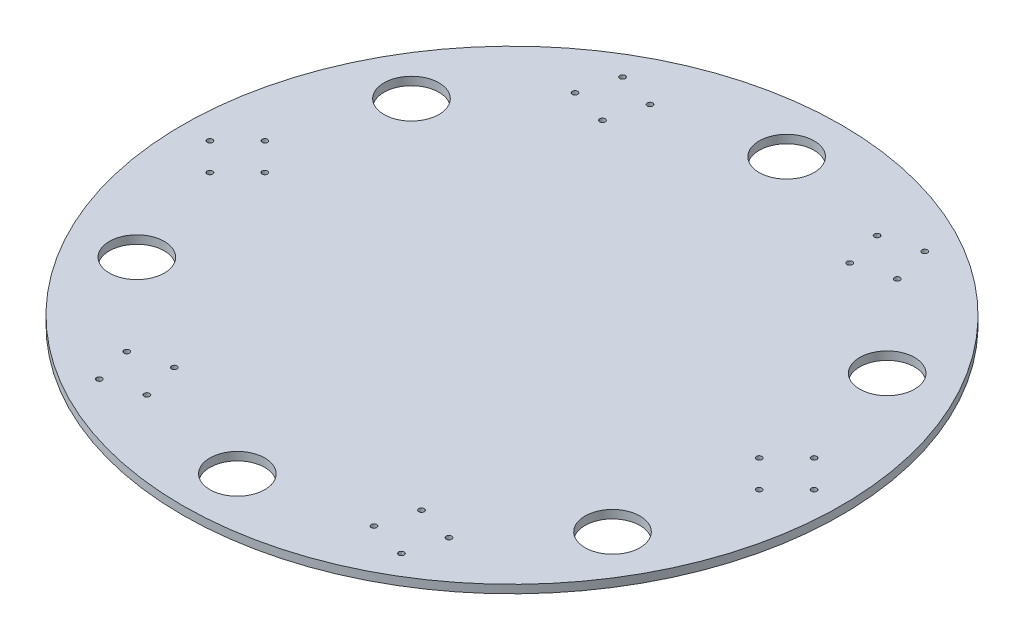
ISO-10303-21;
HEADER;
FILE_DESCRIPTION(('STEP AP214'),'2;1');
FILE_NAME('part.step','',(''),(''),'','','');
FILE_SCHEMA(('AUTOMOTIVE_DESIGN { 1 0 10303 214 1 1 1 1 }'));
ENDSEC;
DATA;
#1=APPLICATION_CONTEXT('core data for automotive mechanical design processes');
#2=APPLICATION_PROTOCOL_DEFINITION('international standard','automotive_design',2000,#1);
#3=PRODUCT_CONTEXT('',#1,'mechanical');
#4=PRODUCT('Part','Part','',(#3));
#5=PRODUCT_RELATED_PRODUCT_CATEGORY('part','',(#4));
#6=PRODUCT_DEFINITION_FORMATION('','',#4);
#7=PRODUCT_DEFINITION_CONTEXT('part definition',#1,'design');
#8=PRODUCT_DEFINITION('design','',#6,#7);
#9=PRODUCT_DEFINITION_SHAPE('','',#8);
#10=(LENGTH_UNIT() NAMED_UNIT(*) SI_UNIT(.MILLI.,.METRE.));
#11=(NAMED_UNIT(*) PLANE_ANGLE_UNIT() SI_UNIT($,.RADIAN.));
#12=(NAMED_UNIT(*) SI_UNIT($,.STERADIAN.) SOLID_ANGLE_UNIT());
#13=UNCERTAINTY_MEASURE_WITH_UNIT(LENGTH_MEASURE(1.E-05),#10,'distance_accuracy_value','');
#14=(GEOMETRIC_REPRESENTATION_CONTEXT(3) GLOBAL_UNCERTAINTY_ASSIGNED_CONTEXT((#13)) GLOBAL_UNIT_ASSIGNED_CONTEXT((#10,
#11,#12)) REPRESENTATION_CONTEXT('',''));
#15=CARTESIAN_POINT('',(0.,0.,0.));
#16=DIRECTION('',(0.,0.,1.));
#17=DIRECTION('',(1.,0.,0.));
#18=AXIS2_PLACEMENT_3D('',#15,#16,#17);
#19=CARTESIAN_POINT('',(0.,3.,0.));
#20=DIRECTION('',(0.,1.,0.));
#21=DIRECTION('',(0.,0.,1.));
#22=AXIS2_PLACEMENT_3D('',#19,#20,#21);
#23=PLANE('',#22);
#24=CARTESIAN_POINT('',(86.6025403784481,3.,49.9999999999976));
#25=DIRECTION('',(0.,1.,0.));
#26=DIRECTION('',(0.,0.,1.));
#27=AXIS2_PLACEMENT_3D('',#24,#25,#26);
#28=CIRCLE('',#27,10.0000000000024);
#29=CARTESIAN_POINT('',(86.6025403784481,3.,60.));
#30=VERTEX_POINT('',#29);
#31=EDGE_CURVE('E213',#30,#30,#28,.T.);
#32=ORIENTED_EDGE('',*,*,#31,.F.);
#33=EDGE_LOOP('',(#32));
#34=FACE_BOUND('',#33,.T.);
#35=CARTESIAN_POINT('',(-86.6025403784397,3.,50.0000000000024));
#36=DIRECTION('',(0.,1.,0.));
#37=DIRECTION('',(0.,0.,1.));
#38=AXIS2_PLACEMENT_3D('',#35,#36,#37);
#39=CIRCLE('',#38,10.0000000000043);
#40=CARTESIAN_POINT('',(-86.6025403784397,3.,60.0000000000067));
#41=VERTEX_POINT('',#40);
#42=EDGE_CURVE('E201',#41,#41,#39,.T.);
#43=ORIENTED_EDGE('',*,*,#42,.F.);
#44=EDGE_LOOP('',(#43));
#45=FACE_BOUND('',#44,.T.);
#46=CARTESIAN_POINT('',(41.3397459621556,3.,-91.6025403784439));
#47=DIRECTION('',(0.,1.,0.));
#48=DIRECTION('',(0.,0.,1.));
#49=AXIS2_PLACEMENT_3D('',#46,#47,#48);
#50=CIRCLE('',#49,0.999999999996972);
#51=CARTESIAN_POINT('',(41.3397459621556,3.,-90.6025403784469));
#52=VERTEX_POINT('',#51);
#53=EDGE_CURVE('E189',#52,#52,#50,.T.);
#54=ORIENTED_EDGE('',*,*,#53,.F.);
#55=EDGE_LOOP('',(#54));
#56=FACE_BOUND('',#55,.T.);
#57=CARTESIAN_POINT('',(58.6602540378443,3.,-81.6025403784439));
#58=DIRECTION('',(0.,1.,0.));
#59=DIRECTION('',(0.,0.,1.));
#60=AXIS2_PLACEMENT_3D('',#57,#58,#59);
#61=CIRCLE('',#60,0.999999999996993);
#62=CARTESIAN_POINT('',(58.6602540378443,3.,-80.6025403784469));
#63=VERTEX_POINT('',#62);
#64=EDGE_CURVE('E177',#63,#63,#61,.T.);
#65=ORIENTED_EDGE('',*,*,#64,.F.);
#66=EDGE_LOOP('',(#65));
#67=FACE_BOUND('',#66,.T.);
#68=CARTESIAN_POINT('',(-58.6602540378444,3.,-81.6025403784439));
#69=DIRECTION('',(0.,1.,0.));
#70=DIRECTION('',(0.,0.,1.));
#71=AXIS2_PLACEMENT_3D('',#68,#69,#70);
#72=CIRCLE('',#71,0.999999999996093);
#73=CARTESIAN_POINT('',(-58.6602540378444,3.,-80.6025403784478));
#74=VERTEX_POINT('',#73);
#75=EDGE_CURVE('E165',#74,#74,#72,.T.);
#76=ORIENTED_EDGE('',*,*,#75,.F.);
#77=EDGE_LOOP('',(#76));
#78=FACE_BOUND('',#77,.T.);
#79=CARTESIAN_POINT('',(-41.3397459621557,3.,-91.6025403784438));
#80=DIRECTION('',(0.,1.,0.));
#81=DIRECTION('',(0.,0.,1.));
#82=AXIS2_PLACEMENT_3D('',#79,#80,#81);
#83=CIRCLE('',#82,0.999999999996075);
#84=CARTESIAN_POINT('',(-41.3397459621557,3.,-90.6025403784478));
#85=VERTEX_POINT('',#84);
#86=EDGE_CURVE('E153',#85,#85,#83,.T.);
#87=ORIENTED_EDGE('',*,*,#86,.F.);
#88=EDGE_LOOP('',(#87));
#89=FACE_BOUND('',#88,.T.);
#90=CARTESIAN_POINT('',(-100.,3.,9.99999999999999));
#91=DIRECTION('',(0.,1.,0.));
#92=DIRECTION('',(0.,0.,1.));
#93=AXIS2_PLACEMENT_3D('',#90,#91,#92);
#94=CIRCLE('',#93,0.999999999998192);
#95=CARTESIAN_POINT('',(-100.,3.,10.9999999999982));
#96=VERTEX_POINT('',#95);
#97=EDGE_CURVE('E141',#96,#96,#94,.T.);
#98=ORIENTED_EDGE('',*,*,#97,.F.);
#99=EDGE_LOOP('',(#98));
#100=FACE_BOUND('',#99,.T.);
#101=CARTESIAN_POINT('',(-100.,3.,-9.99999999999999));
#102=DIRECTION('',(0.,1.,0.));
#103=DIRECTION('',(0.,0.,1.));
#104=AXIS2_PLACEMENT_3D('',#101,#102,#103);
#105=CIRCLE('',#104,0.999999999998194);
#106=CARTESIAN_POINT('',(-100.,3.,-9.0000000000018));
#107=VERTEX_POINT('',#106);
#108=EDGE_CURVE('E129',#107,#107,#105,.T.);
#109=ORIENTED_EDGE('',*,*,#108,.F.);
#110=EDGE_LOOP('',(#109));
#111=FACE_BOUND('',#110,.T.);
#112=CARTESIAN_POINT('',(-41.3397459621556,3.,91.6025403784439));
#113=DIRECTION('',(0.,1.,0.));
#114=DIRECTION('',(0.,0.,1.));
#115=AXIS2_PLACEMENT_3D('',#112,#113,#114);
#116=CIRCLE('',#115,1.00000000000121);
#117=CARTESIAN_POINT('',(-41.3397459621556,3.,92.6025403784451));
#118=VERTEX_POINT('',#117);
#119=EDGE_CURVE('E117',#118,#118,#116,.T.);
#120=ORIENTED_EDGE('',*,*,#119,.F.);
#121=EDGE_LOOP('',(#120));
#122=FACE_BOUND('',#121,.T.);
#123=CARTESIAN_POINT('',(-58.6602540378444,3.,81.6025403784439));
#124=DIRECTION('',(0.,1.,0.));
#125=DIRECTION('',(0.,0.,1.));
#126=AXIS2_PLACEMENT_3D('',#123,#124,#125);
#127=CIRCLE('',#126,1.0000000000012);
#128=CARTESIAN_POINT('',(-58.6602540378444,3.,82.6025403784451));
#129=VERTEX_POINT('',#128);
#130=EDGE_CURVE('E105',#129,#129,#127,.T.);
#131=ORIENTED_EDGE('',*,*,#130,.F.);
#132=EDGE_LOOP('',(#131));
#133=FACE_BOUND('',#132,.T.);
#134=CARTESIAN_POINT('',(100.,3.,-9.99999999999999));
#135=DIRECTION('',(0.,1.,0.));
#136=DIRECTION('',(0.,0.,1.));
#137=AXIS2_PLACEMENT_3D('',#134,#135,#136);
#138=CIRCLE('',#137,0.999999999999998);
#139=CARTESIAN_POINT('',(100.,3.,-9.));
#140=VERTEX_POINT('',#139);
#141=EDGE_CURVE('E93',#140,#140,#138,.T.);
#142=ORIENTED_EDGE('',*,*,#141,.F.);
#143=EDGE_LOOP('',(#142));
#144=FACE_BOUND('',#143,.T.);
#145=CARTESIAN_POINT('',(100.,3.,9.99999999999999));
#146=DIRECTION('',(0.,1.,0.));
#147=DIRECTION('',(0.,0.,1.));
#148=AXIS2_PLACEMENT_3D('',#145,#146,#147);
#149=CIRCLE('',#148,0.999999999999998);
#150=CARTESIAN_POINT('',(100.,3.,11.));
#151=VERTEX_POINT('',#150);
#152=EDGE_CURVE('E81',#151,#151,#149,.T.);
#153=ORIENTED_EDGE('',*,*,#152,.F.);
#154=EDGE_LOOP('',(#153));
#155=FACE_BOUND('',#154,.T.);
#156=CARTESIAN_POINT('',(45.,3.,77.9422863405995));
#157=DIRECTION('',(0.,1.,0.));
#158=DIRECTION('',(0.,0.,1.));
#159=AXIS2_PLACEMENT_3D('',#156,#157,#158);
#160=CIRCLE('',#159,1.0000000000021);
#161=CARTESIAN_POINT('',(45.,3.,78.9422863406016));
#162=VERTEX_POINT('',#161);
#163=EDGE_CURVE('E69',#162,#162,#160,.T.);
#164=ORIENTED_EDGE('',*,*,#163,.F.);
#165=EDGE_LOOP('',(#164));
#166=FACE_BOUND('',#165,.T.);
#167=CARTESIAN_POINT('',(55.,3.,95.2627944162883));
#168=DIRECTION('',(0.,1.,0.));
#169=DIRECTION('',(0.,0.,1.));
#170=AXIS2_PLACEMENT_3D('',#167,#168,#169);
#171=CIRCLE('',#170,1.0000000000021);
#172=CARTESIAN_POINT('',(55.,3.,96.2627944162903));
#173=VERTEX_POINT('',#172);
#174=EDGE_CURVE('E57',#173,#173,#171,.T.);
#175=ORIENTED_EDGE('',*,*,#174,.F.);
#176=EDGE_LOOP('',(#175));
#177=FACE_BOUND('',#176,.T.);
#178=CARTESIAN_POINT('',(110.,3.,0.));
#179=DIRECTION('',(0.,1.,0.));
#180=DIRECTION('',(0.,0.,1.));
#181=AXIS2_PLACEMENT_3D('',#178,#179,#180);
#182=CIRCLE('',#181,0.999999999999998);
#183=CARTESIAN_POINT('',(110.,3.,0.999999999999998));
#184=VERTEX_POINT('',#183);
#185=EDGE_CURVE('E46',#184,#184,#182,.T.);
#186=ORIENTED_EDGE('',*,*,#185,.F.);
#187=EDGE_LOOP('',(#186));
#188=FACE_BOUND('',#187,.T.);
#189=CARTESIAN_POINT('',(0.,3.,0.));
#190=DIRECTION('',(0.,1.,0.));
#191=DIRECTION('',(0.,0.,1.));
#192=AXIS2_PLACEMENT_3D('',#189,#190,#191);
#193=CIRCLE('',#192,120.);
#194=CARTESIAN_POINT('',(0.,3.,120.));
#195=VERTEX_POINT('',#194);
#196=EDGE_CURVE('E10',#195,#195,#193,.T.);
#197=ORIENTED_EDGE('',*,*,#196,.T.);
#198=EDGE_LOOP('',(#197));
#199=FACE_BOUND('',#198,.T.);
#200=CARTESIAN_POINT('',(0.,3.,-100.));
#201=DIRECTION('',(0.,1.,0.));
#202=DIRECTION('',(0.,0.,1.));
#203=AXIS2_PLACEMENT_3D('',#200,#201,#202);
#204=CIRCLE('',#203,10.);
#205=CARTESIAN_POINT('',(0.,3.,-90.));
#206=VERTEX_POINT('',#205);
#207=EDGE_CURVE('E51',#206,#206,#204,.T.);
#208=ORIENTED_EDGE('',*,*,#207,.F.);
#209=EDGE_LOOP('',(#208));
#210=FACE_BOUND('',#209,.T.);
#211=CARTESIAN_POINT('',(41.3397459621556,3.,91.6025403784439));
#212=DIRECTION('',(0.,1.,0.));
#213=DIRECTION('',(0.,0.,1.));
#214=AXIS2_PLACEMENT_3D('',#211,#212,#213);
#215=CIRCLE('',#214,1.0000000000021);
#216=CARTESIAN_POINT('',(41.3397459621556,3.,92.602540378446));
#217=VERTEX_POINT('',#216);
#218=EDGE_CURVE('E63',#217,#217,#215,.T.);
#219=ORIENTED_EDGE('',*,*,#218,.F.);
#220=EDGE_LOOP('',(#219));
#221=FACE_BOUND('',#220,.T.);
#222=CARTESIAN_POINT('',(58.6602540378444,3.,81.6025403784439));
#223=DIRECTION('',(0.,1.,0.));
#224=DIRECTION('',(0.,0.,1.));
#225=AXIS2_PLACEMENT_3D('',#222,#223,#224);
#226=CIRCLE('',#225,1.00000000000209);
#227=CARTESIAN_POINT('',(58.6602540378444,3.,82.6025403784459));
#228=VERTEX_POINT('',#227);
#229=EDGE_CURVE('E75',#228,#228,#226,.T.);
#230=ORIENTED_EDGE('',*,*,#229,.F.);
#231=EDGE_LOOP('',(#230));
#232=FACE_BOUND('',#231,.T.);
#233=CARTESIAN_POINT('',(90.,3.,0.));
#234=DIRECTION('',(0.,1.,0.));
#235=DIRECTION('',(0.,0.,1.));
#236=AXIS2_PLACEMENT_3D('',#233,#234,#235);
#237=CIRCLE('',#236,0.999999999999998);
#238=CARTESIAN_POINT('',(90.,3.,0.999999999999999));
#239=VERTEX_POINT('',#238);
#240=EDGE_CURVE('E87',#239,#239,#237,.T.);
#241=ORIENTED_EDGE('',*,*,#240,.F.);
#242=EDGE_LOOP('',(#241));
#243=FACE_BOUND('',#242,.T.);
#244=CARTESIAN_POINT('',(-55.,3.,95.2627944162883));
#245=DIRECTION('',(0.,1.,0.));
#246=DIRECTION('',(0.,0.,1.));
#247=AXIS2_PLACEMENT_3D('',#244,#245,#246);
#248=CIRCLE('',#247,1.0000000000012);
#249=CARTESIAN_POINT('',(-55.,3.,96.2627944162895));
#250=VERTEX_POINT('',#249);
#251=EDGE_CURVE('E99',#250,#250,#248,.T.);
#252=ORIENTED_EDGE('',*,*,#251,.F.);
#253=EDGE_LOOP('',(#252));
#254=FACE_BOUND('',#253,.T.);
#255=CARTESIAN_POINT('',(-45.,3.,77.9422863405995));
#256=DIRECTION('',(0.,1.,0.));
#257=DIRECTION('',(0.,0.,1.));
#258=AXIS2_PLACEMENT_3D('',#255,#256,#257);
#259=CIRCLE('',#258,1.0000000000012);
#260=CARTESIAN_POINT('',(-45.,3.,78.9422863406007));
#261=VERTEX_POINT('',#260);
#262=EDGE_CURVE('E111',#261,#261,#259,.T.);
#263=ORIENTED_EDGE('',*,*,#262,.F.);
#264=EDGE_LOOP('',(#263));
#265=FACE_BOUND('',#264,.T.);
#266=CARTESIAN_POINT('',(-110.,3.,0.));
#267=DIRECTION('',(0.,1.,0.));
#268=DIRECTION('',(0.,0.,1.));
#269=AXIS2_PLACEMENT_3D('',#266,#267,#268);
#270=CIRCLE('',#269,0.999999999998194);
#271=CARTESIAN_POINT('',(-110.,3.,0.999999999998195));
#272=VERTEX_POINT('',#271);
#273=EDGE_CURVE('E123',#272,#272,#270,.T.);
#274=ORIENTED_EDGE('',*,*,#273,.F.);
#275=EDGE_LOOP('',(#274));
#276=FACE_BOUND('',#275,.T.);
#277=CARTESIAN_POINT('',(-90.,3.,0.));
#278=DIRECTION('',(0.,1.,0.));
#279=DIRECTION('',(0.,0.,1.));
#280=AXIS2_PLACEMENT_3D('',#277,#278,#279);
#281=CIRCLE('',#280,0.999999999998194);
#282=CARTESIAN_POINT('',(-90.,3.,0.999999999998191));
#283=VERTEX_POINT('',#282);
#284=EDGE_CURVE('E135',#283,#283,#281,.T.);
#285=ORIENTED_EDGE('',*,*,#284,.F.);
#286=EDGE_LOOP('',(#285));
#287=FACE_BOUND('',#286,.T.);
#288=CARTESIAN_POINT('',(-55.,3.,-95.2627944162882));
#289=DIRECTION('',(0.,1.,0.));
#290=DIRECTION('',(0.,0.,1.));
#291=AXIS2_PLACEMENT_3D('',#288,#289,#290);
#292=CIRCLE('',#291,0.999999999996082);
#293=CARTESIAN_POINT('',(-55.,3.,-94.2627944162922));
#294=VERTEX_POINT('',#293);
#295=EDGE_CURVE('E147',#294,#294,#292,.T.);
#296=ORIENTED_EDGE('',*,*,#295,.F.);
#297=EDGE_LOOP('',(#296));
#298=FACE_BOUND('',#297,.T.);
#299=CARTESIAN_POINT('',(-45.,3.,-77.9422863405995));
#300=DIRECTION('',(0.,1.,0.));
#301=DIRECTION('',(0.,0.,1.));
#302=AXIS2_PLACEMENT_3D('',#299,#300,#301);
#303=CIRCLE('',#302,0.999999999996095);
#304=CARTESIAN_POINT('',(-45.,3.,-76.9422863406034));
#305=VERTEX_POINT('',#304);
#306=EDGE_CURVE('E159',#305,#305,#303,.T.);
#307=ORIENTED_EDGE('',*,*,#306,.F.);
#308=EDGE_LOOP('',(#307));
#309=FACE_BOUND('',#308,.T.);
#310=CARTESIAN_POINT('',(55.,3.,-95.2627944162883));
#311=DIRECTION('',(0.,1.,0.));
#312=DIRECTION('',(0.,0.,1.));
#313=AXIS2_PLACEMENT_3D('',#310,#311,#312);
#314=CIRCLE('',#313,0.999999999996969);
#315=CARTESIAN_POINT('',(55.,3.,-94.2627944162913));
#316=VERTEX_POINT('',#315);
#317=EDGE_CURVE('E171',#316,#316,#314,.T.);
#318=ORIENTED_EDGE('',*,*,#317,.F.);
#319=EDGE_LOOP('',(#318));
#320=FACE_BOUND('',#319,.T.);
#321=CARTESIAN_POINT('',(45.,3.,-77.9422863405995));
#322=DIRECTION('',(0.,1.,0.));
#323=DIRECTION('',(0.,0.,1.));
#324=AXIS2_PLACEMENT_3D('',#321,#322,#323);
#325=CIRCLE('',#324,0.999999999997);
#326=CARTESIAN_POINT('',(45.,3.,-76.9422863406025));
#327=VERTEX_POINT('',#326);
#328=EDGE_CURVE('E183',#327,#327,#325,.T.);
#329=ORIENTED_EDGE('',*,*,#328,.F.);
#330=EDGE_LOOP('',(#329));
#331=FACE_BOUND('',#330,.T.);
#332=CARTESIAN_POINT('',(-86.6025403784425,3.,-49.9999999999976));
#333=DIRECTION('',(0.,1.,0.));
#334=DIRECTION('',(0.,0.,1.));
#335=AXIS2_PLACEMENT_3D('',#332,#333,#334);
#336=CIRCLE('',#335,10.0000000000018);
#337=CARTESIAN_POINT('',(-86.6025403784425,3.,-39.9999999999958));
#338=VERTEX_POINT('',#337);
#339=EDGE_CURVE('E195',#338,#338,#336,.T.);
#340=ORIENTED_EDGE('',*,*,#339,.F.);
#341=EDGE_LOOP('',(#340));
#342=FACE_BOUND('',#341,.T.);
#343=CARTESIAN_POINT('',(5.63535601411491E-12,3.,100.));
#344=DIRECTION('',(0.,1.,0.));
#345=DIRECTION('',(0.,0.,1.));
#346=AXIS2_PLACEMENT_3D('',#343,#344,#345);
#347=CIRCLE('',#346,10.0000000000047);
#348=CARTESIAN_POINT('',(5.63535601411491E-12,3.,110.000000000005));
#349=VERTEX_POINT('',#348);
#350=EDGE_CURVE('E207',#349,#349,#347,.T.);
#351=ORIENTED_EDGE('',*,*,#350,.F.);
#352=EDGE_LOOP('',(#351));
#353=FACE_BOUND('',#352,.T.);
#354=CARTESIAN_POINT('',(86.6025403784433,3.,-50.000000000001));
#355=DIRECTION('',(0.,1.,0.));
#356=DIRECTION('',(0.,0.,1.));
#357=AXIS2_PLACEMENT_3D('',#354,#355,#356);
#358=CIRCLE('',#357,10.);
#359=CARTESIAN_POINT('',(86.6025403784433,3.,-40.000000000001));
#360=VERTEX_POINT('',#359);
#361=EDGE_CURVE('E219',#360,#360,#358,.T.);
#362=ORIENTED_EDGE('',*,*,#361,.F.);
#363=EDGE_LOOP('',(#362));
#364=FACE_BOUND('',#363,.T.);
#365=ADVANCED_FACE('F35',(#34,#45,#56,#67,#78,#89,#100,#111,#122,#133,#144,#155,#166,#177,#188,
#199,#210,#221,#232,#243,#254,#265,#276,#287,#298,#309,#320,#331,#342,#353,#364),#23,.T.);
#366=CARTESIAN_POINT('',(0.,0.,0.));
#367=DIRECTION('',(0.,1.,0.));
#368=DIRECTION('',(0.,0.,1.));
#369=AXIS2_PLACEMENT_3D('',#366,#367,#368);
#370=PLANE('',#369);
#371=CARTESIAN_POINT('',(86.6025403784481,0.,49.9999999999976));
#372=DIRECTION('',(0.,1.,0.));
#373=DIRECTION('',(0.,0.,1.));
#374=AXIS2_PLACEMENT_3D('',#371,#372,#373);
#375=CIRCLE('',#374,10.0000000000024);
#376=CARTESIAN_POINT('',(86.6025403784481,0.,60.));
#377=VERTEX_POINT('',#376);
#378=EDGE_CURVE('E216',#377,#377,#375,.T.);
#379=ORIENTED_EDGE('',*,*,#378,.T.);
#380=EDGE_LOOP('',(#379));
#381=FACE_BOUND('',#380,.T.);
#382=CARTESIAN_POINT('',(-86.6025403784397,0.,50.0000000000024));
#383=DIRECTION('',(0.,1.,0.));
#384=DIRECTION('',(0.,0.,1.));
#385=AXIS2_PLACEMENT_3D('',#382,#383,#384);
#386=CIRCLE('',#385,10.0000000000043);
#387=CARTESIAN_POINT('',(-86.6025403784397,0.,60.0000000000067));
#388=VERTEX_POINT('',#387);
#389=EDGE_CURVE('E204',#388,#388,#386,.T.);
#390=ORIENTED_EDGE('',*,*,#389,.T.);
#391=EDGE_LOOP('',(#390));
#392=FACE_BOUND('',#391,.T.);
#393=CARTESIAN_POINT('',(41.3397459621556,0.,-91.6025403784439));
#394=DIRECTION('',(0.,1.,0.));
#395=DIRECTION('',(0.,0.,1.));
#396=AXIS2_PLACEMENT_3D('',#393,#394,#395);
#397=CIRCLE('',#396,0.999999999996972);
#398=CARTESIAN_POINT('',(41.3397459621556,0.,-90.6025403784469));
#399=VERTEX_POINT('',#398);
#400=EDGE_CURVE('E192',#399,#399,#397,.T.);
#401=ORIENTED_EDGE('',*,*,#400,.T.);
#402=EDGE_LOOP('',(#401));
#403=FACE_BOUND('',#402,.T.);
#404=CARTESIAN_POINT('',(58.6602540378443,0.,-81.6025403784439));
#405=DIRECTION('',(0.,1.,0.));
#406=DIRECTION('',(0.,0.,1.));
#407=AXIS2_PLACEMENT_3D('',#404,#405,#406);
#408=CIRCLE('',#407,0.999999999996993);
#409=CARTESIAN_POINT('',(58.6602540378443,0.,-80.6025403784469));
#410=VERTEX_POINT('',#409);
#411=EDGE_CURVE('E180',#410,#410,#408,.T.);
#412=ORIENTED_EDGE('',*,*,#411,.T.);
#413=EDGE_LOOP('',(#412));
#414=FACE_BOUND('',#413,.T.);
#415=CARTESIAN_POINT('',(-58.6602540378444,0.,-81.6025403784439));
#416=DIRECTION('',(0.,1.,0.));
#417=DIRECTION('',(0.,0.,1.));
#418=AXIS2_PLACEMENT_3D('',#415,#416,#417);
#419=CIRCLE('',#418,0.999999999996093);
#420=CARTESIAN_POINT('',(-58.6602540378444,0.,-80.6025403784478));
#421=VERTEX_POINT('',#420);
#422=EDGE_CURVE('E168',#421,#421,#419,.T.);
#423=ORIENTED_EDGE('',*,*,#422,.T.);
#424=EDGE_LOOP('',(#423));
#425=FACE_BOUND('',#424,.T.);
#426=CARTESIAN_POINT('',(-41.3397459621557,0.,-91.6025403784438));
#427=DIRECTION('',(0.,1.,0.));
#428=DIRECTION('',(0.,0.,1.));
#429=AXIS2_PLACEMENT_3D('',#426,#427,#428);
#430=CIRCLE('',#429,0.999999999996075);
#431=CARTESIAN_POINT('',(-41.3397459621557,0.,-90.6025403784478));
#432=VERTEX_POINT('',#431);
#433=EDGE_CURVE('E156',#432,#432,#430,.T.);
#434=ORIENTED_EDGE('',*,*,#433,.T.);
#435=EDGE_LOOP('',(#434));
#436=FACE_BOUND('',#435,.T.);
#437=CARTESIAN_POINT('',(-100.,0.,9.99999999999999));
#438=DIRECTION('',(0.,1.,0.));
#439=DIRECTION('',(0.,0.,1.));
#440=AXIS2_PLACEMENT_3D('',#437,#438,#439);
#441=CIRCLE('',#440,0.999999999998192);
#442=CARTESIAN_POINT('',(-100.,0.,10.9999999999982));
#443=VERTEX_POINT('',#442);
#444=EDGE_CURVE('E144',#443,#443,#441,.T.);
#445=ORIENTED_EDGE('',*,*,#444,.T.);
#446=EDGE_LOOP('',(#445));
#447=FACE_BOUND('',#446,.T.);
#448=CARTESIAN_POINT('',(-100.,0.,-9.99999999999999));
#449=DIRECTION('',(0.,1.,0.));
#450=DIRECTION('',(0.,0.,1.));
#451=AXIS2_PLACEMENT_3D('',#448,#449,#450);
#452=CIRCLE('',#451,0.999999999998194);
#453=CARTESIAN_POINT('',(-100.,0.,-9.0000000000018));
#454=VERTEX_POINT('',#453);
#455=EDGE_CURVE('E132',#454,#454,#452,.T.);
#456=ORIENTED_EDGE('',*,*,#455,.T.);
#457=EDGE_LOOP('',(#456));
#458=FACE_BOUND('',#457,.T.);
#459=CARTESIAN_POINT('',(-41.3397459621556,0.,91.6025403784439));
#460=DIRECTION('',(0.,1.,0.));
#461=DIRECTION('',(0.,0.,1.));
#462=AXIS2_PLACEMENT_3D('',#459,#460,#461);
#463=CIRCLE('',#462,1.00000000000121);
#464=CARTESIAN_POINT('',(-41.3397459621556,0.,92.6025403784451));
#465=VERTEX_POINT('',#464);
#466=EDGE_CURVE('E120',#465,#465,#463,.T.);
#467=ORIENTED_EDGE('',*,*,#466,.T.);
#468=EDGE_LOOP('',(#467));
#469=FACE_BOUND('',#468,.T.);
#470=CARTESIAN_POINT('',(-58.6602540378444,0.,81.6025403784439));
#471=DIRECTION('',(0.,1.,0.));
#472=DIRECTION('',(0.,0.,1.));
#473=AXIS2_PLACEMENT_3D('',#470,#471,#472);
#474=CIRCLE('',#473,1.0000000000012);
#475=CARTESIAN_POINT('',(-58.6602540378444,0.,82.6025403784451));
#476=VERTEX_POINT('',#475);
#477=EDGE_CURVE('E108',#476,#476,#474,.T.);
#478=ORIENTED_EDGE('',*,*,#477,.T.);
#479=EDGE_LOOP('',(#478));
#480=FACE_BOUND('',#479,.T.);
#481=CARTESIAN_POINT('',(100.,0.,-9.99999999999999));
#482=DIRECTION('',(0.,1.,0.));
#483=DIRECTION('',(0.,0.,1.));
#484=AXIS2_PLACEMENT_3D('',#481,#482,#483);
#485=CIRCLE('',#484,0.999999999999998);
#486=CARTESIAN_POINT('',(100.,0.,-9.));
#487=VERTEX_POINT('',#486);
#488=EDGE_CURVE('E96',#487,#487,#485,.T.);
#489=ORIENTED_EDGE('',*,*,#488,.T.);
#490=EDGE_LOOP('',(#489));
#491=FACE_BOUND('',#490,.T.);
#492=CARTESIAN_POINT('',(100.,0.,9.99999999999999));
#493=DIRECTION('',(0.,1.,0.));
#494=DIRECTION('',(0.,0.,1.));
#495=AXIS2_PLACEMENT_3D('',#492,#493,#494);
#496=CIRCLE('',#495,0.999999999999998);
#497=CARTESIAN_POINT('',(100.,0.,11.));
#498=VERTEX_POINT('',#497);
#499=EDGE_CURVE('E84',#498,#498,#496,.T.);
#500=ORIENTED_EDGE('',*,*,#499,.T.);
#501=EDGE_LOOP('',(#500));
#502=FACE_BOUND('',#501,.T.);
#503=CARTESIAN_POINT('',(45.,0.,77.9422863405995));
#504=DIRECTION('',(0.,1.,0.));
#505=DIRECTION('',(0.,0.,1.));
#506=AXIS2_PLACEMENT_3D('',#503,#504,#505);
#507=CIRCLE('',#506,1.0000000000021);
#508=CARTESIAN_POINT('',(45.,0.,78.9422863406016));
#509=VERTEX_POINT('',#508);
#510=EDGE_CURVE('E72',#509,#509,#507,.T.);
#511=ORIENTED_EDGE('',*,*,#510,.T.);
#512=EDGE_LOOP('',(#511));
#513=FACE_BOUND('',#512,.T.);
#514=CARTESIAN_POINT('',(55.,0.,95.2627944162883));
#515=DIRECTION('',(0.,1.,0.));
#516=DIRECTION('',(0.,0.,1.));
#517=AXIS2_PLACEMENT_3D('',#514,#515,#516);
#518=CIRCLE('',#517,1.0000000000021);
#519=CARTESIAN_POINT('',(55.,0.,96.2627944162903));
#520=VERTEX_POINT('',#519);
#521=EDGE_CURVE('E60',#520,#520,#518,.T.);
#522=ORIENTED_EDGE('',*,*,#521,.T.);
#523=EDGE_LOOP('',(#522));
#524=FACE_BOUND('',#523,.T.);
#525=CARTESIAN_POINT('',(110.,0.,0.));
#526=DIRECTION('',(0.,1.,0.));
#527=DIRECTION('',(0.,0.,1.));
#528=AXIS2_PLACEMENT_3D('',#525,#526,#527);
#529=CIRCLE('',#528,0.999999999999998);
#530=CARTESIAN_POINT('',(110.,0.,0.999999999999998));
#531=VERTEX_POINT('',#530);
#532=EDGE_CURVE('E48',#531,#531,#529,.T.);
#533=ORIENTED_EDGE('',*,*,#532,.T.);
#534=EDGE_LOOP('',(#533));
#535=FACE_BOUND('',#534,.T.);
#536=CARTESIAN_POINT('',(0.,0.,0.));
#537=DIRECTION('',(0.,1.,0.));
#538=DIRECTION('',(0.,0.,1.));
#539=AXIS2_PLACEMENT_3D('',#536,#537,#538);
#540=CIRCLE('',#539,120.);
#541=CARTESIAN_POINT('',(0.,0.,120.));
#542=VERTEX_POINT('',#541);
#543=EDGE_CURVE('E39',#542,#542,#540,.T.);
#544=ORIENTED_EDGE('',*,*,#543,.F.);
#545=EDGE_LOOP('',(#544));
#546=FACE_BOUND('',#545,.T.);
#547=CARTESIAN_POINT('',(0.,0.,-100.));
#548=DIRECTION('',(0.,1.,0.));
#549=DIRECTION('',(0.,0.,1.));
#550=AXIS2_PLACEMENT_3D('',#547,#548,#549);
#551=CIRCLE('',#550,10.);
#552=CARTESIAN_POINT('',(0.,0.,-90.));
#553=VERTEX_POINT('',#552);
#554=EDGE_CURVE('E54',#553,#553,#551,.T.);
#555=ORIENTED_EDGE('',*,*,#554,.T.);
#556=EDGE_LOOP('',(#555));
#557=FACE_BOUND('',#556,.T.);
#558=CARTESIAN_POINT('',(41.3397459621556,0.,91.6025403784439));
#559=DIRECTION('',(0.,1.,0.));
#560=DIRECTION('',(0.,0.,1.));
#561=AXIS2_PLACEMENT_3D('',#558,#559,#560);
#562=CIRCLE('',#561,1.0000000000021);
#563=CARTESIAN_POINT('',(41.3397459621556,0.,92.602540378446));
#564=VERTEX_POINT('',#563);
#565=EDGE_CURVE('E66',#564,#564,#562,.T.);
#566=ORIENTED_EDGE('',*,*,#565,.T.);
#567=EDGE_LOOP('',(#566));
#568=FACE_BOUND('',#567,.T.);
#569=CARTESIAN_POINT('',(58.6602540378444,0.,81.6025403784439));
#570=DIRECTION('',(0.,1.,0.));
#571=DIRECTION('',(0.,0.,1.));
#572=AXIS2_PLACEMENT_3D('',#569,#570,#571);
#573=CIRCLE('',#572,1.00000000000209);
#574=CARTESIAN_POINT('',(58.6602540378444,0.,82.6025403784459));
#575=VERTEX_POINT('',#574);
#576=EDGE_CURVE('E78',#575,#575,#573,.T.);
#577=ORIENTED_EDGE('',*,*,#576,.T.);
#578=EDGE_LOOP('',(#577));
#579=FACE_BOUND('',#578,.T.);
#580=CARTESIAN_POINT('',(90.,0.,0.));
#581=DIRECTION('',(0.,1.,0.));
#582=DIRECTION('',(0.,0.,1.));
#583=AXIS2_PLACEMENT_3D('',#580,#581,#582);
#584=CIRCLE('',#583,0.999999999999998);
#585=CARTESIAN_POINT('',(90.,0.,0.999999999999999));
#586=VERTEX_POINT('',#585);
#587=EDGE_CURVE('E90',#586,#586,#584,.T.);
#588=ORIENTED_EDGE('',*,*,#587,.T.);
#589=EDGE_LOOP('',(#588));
#590=FACE_BOUND('',#589,.T.);
#591=CARTESIAN_POINT('',(-55.,0.,95.2627944162883));
#592=DIRECTION('',(0.,1.,0.));
#593=DIRECTION('',(0.,0.,1.));
#594=AXIS2_PLACEMENT_3D('',#591,#592,#593);
#595=CIRCLE('',#594,1.0000000000012);
#596=CARTESIAN_POINT('',(-55.,0.,96.2627944162895));
#597=VERTEX_POINT('',#596);
#598=EDGE_CURVE('E102',#597,#597,#595,.T.);
#599=ORIENTED_EDGE('',*,*,#598,.T.);
#600=EDGE_LOOP('',(#599));
#601=FACE_BOUND('',#600,.T.);
#602=CARTESIAN_POINT('',(-45.,0.,77.9422863405995));
#603=DIRECTION('',(0.,1.,0.));
#604=DIRECTION('',(0.,0.,1.));
#605=AXIS2_PLACEMENT_3D('',#602,#603,#604);
#606=CIRCLE('',#605,1.0000000000012);
#607=CARTESIAN_POINT('',(-45.,0.,78.9422863406007));
#608=VERTEX_POINT('',#607);
#609=EDGE_CURVE('E114',#608,#608,#606,.T.);
#610=ORIENTED_EDGE('',*,*,#609,.T.);
#611=EDGE_LOOP('',(#610));
#612=FACE_BOUND('',#611,.T.);
#613=CARTESIAN_POINT('',(-110.,0.,0.));
#614=DIRECTION('',(0.,1.,0.));
#615=DIRECTION('',(0.,0.,1.));
#616=AXIS2_PLACEMENT_3D('',#613,#614,#615);
#617=CIRCLE('',#616,0.999999999998194);
#618=CARTESIAN_POINT('',(-110.,0.,0.999999999998195));
#619=VERTEX_POINT('',#618);
#620=EDGE_CURVE('E126',#619,#619,#617,.T.);
#621=ORIENTED_EDGE('',*,*,#620,.T.);
#622=EDGE_LOOP('',(#621));
#623=FACE_BOUND('',#622,.T.);
#624=CARTESIAN_POINT('',(-90.,0.,0.));
#625=DIRECTION('',(0.,1.,0.));
#626=DIRECTION('',(0.,0.,1.));
#627=AXIS2_PLACEMENT_3D('',#624,#625,#626);
#628=CIRCLE('',#627,0.999999999998194);
#629=CARTESIAN_POINT('',(-90.,0.,0.999999999998191));
#630=VERTEX_POINT('',#629);
#631=EDGE_CURVE('E138',#630,#630,#628,.T.);
#632=ORIENTED_EDGE('',*,*,#631,.T.);
#633=EDGE_LOOP('',(#632));
#634=FACE_BOUND('',#633,.T.);
#635=CARTESIAN_POINT('',(-55.,0.,-95.2627944162882));
#636=DIRECTION('',(0.,1.,0.));
#637=DIRECTION('',(0.,0.,1.));
#638=AXIS2_PLACEMENT_3D('',#635,#636,#637);
#639=CIRCLE('',#638,0.999999999996082);
#640=CARTESIAN_POINT('',(-55.,0.,-94.2627944162922));
#641=VERTEX_POINT('',#640);
#642=EDGE_CURVE('E150',#641,#641,#639,.T.);
#643=ORIENTED_EDGE('',*,*,#642,.T.);
#644=EDGE_LOOP('',(#643));
#645=FACE_BOUND('',#644,.T.);
#646=CARTESIAN_POINT('',(-45.,0.,-77.9422863405995));
#647=DIRECTION('',(0.,1.,0.));
#648=DIRECTION('',(0.,0.,1.));
#649=AXIS2_PLACEMENT_3D('',#646,#647,#648);
#650=CIRCLE('',#649,0.999999999996095);
#651=CARTESIAN_POINT('',(-45.,0.,-76.9422863406034));
#652=VERTEX_POINT('',#651);
#653=EDGE_CURVE('E162',#652,#652,#650,.T.);
#654=ORIENTED_EDGE('',*,*,#653,.T.);
#655=EDGE_LOOP('',(#654));
#656=FACE_BOUND('',#655,.T.);
#657=CARTESIAN_POINT('',(55.,0.,-95.2627944162883));
#658=DIRECTION('',(0.,1.,0.));
#659=DIRECTION('',(0.,0.,1.));
#660=AXIS2_PLACEMENT_3D('',#657,#658,#659);
#661=CIRCLE('',#660,0.999999999996969);
#662=CARTESIAN_POINT('',(55.,0.,-94.2627944162913));
#663=VERTEX_POINT('',#662);
#664=EDGE_CURVE('E174',#663,#663,#661,.T.);
#665=ORIENTED_EDGE('',*,*,#664,.T.);
#666=EDGE_LOOP('',(#665));
#667=FACE_BOUND('',#666,.T.);
#668=CARTESIAN_POINT('',(45.,0.,-77.9422863405995));
#669=DIRECTION('',(0.,1.,0.));
#670=DIRECTION('',(0.,0.,1.));
#671=AXIS2_PLACEMENT_3D('',#668,#669,#670);
#672=CIRCLE('',#671,0.999999999997);
#673=CARTESIAN_POINT('',(45.,0.,-76.9422863406025));
#674=VERTEX_POINT('',#673);
#675=EDGE_CURVE('E186',#674,#674,#672,.T.);
#676=ORIENTED_EDGE('',*,*,#675,.T.);
#677=EDGE_LOOP('',(#676));
#678=FACE_BOUND('',#677,.T.);
#679=CARTESIAN_POINT('',(-86.6025403784425,0.,-49.9999999999976));
#680=DIRECTION('',(0.,1.,0.));
#681=DIRECTION('',(0.,0.,1.));
#682=AXIS2_PLACEMENT_3D('',#679,#680,#681);
#683=CIRCLE('',#682,10.0000000000018);
#684=CARTESIAN_POINT('',(-86.6025403784425,0.,-39.9999999999958));
#685=VERTEX_POINT('',#684);
#686=EDGE_CURVE('E198',#685,#685,#683,.T.);
#687=ORIENTED_EDGE('',*,*,#686,.T.);
#688=EDGE_LOOP('',(#687));
#689=FACE_BOUND('',#688,.T.);
#690=CARTESIAN_POINT('',(5.63535601411491E-12,0.,100.));
#691=DIRECTION('',(0.,1.,0.));
#692=DIRECTION('',(0.,0.,1.));
#693=AXIS2_PLACEMENT_3D('',#690,#691,#692);
#694=CIRCLE('',#693,10.0000000000047);
#695=CARTESIAN_POINT('',(5.63535601411491E-12,0.,110.000000000005));
#696=VERTEX_POINT('',#695);
#697=EDGE_CURVE('E210',#696,#696,#694,.T.);
#698=ORIENTED_EDGE('',*,*,#697,.T.);
#699=EDGE_LOOP('',(#698));
#700=FACE_BOUND('',#699,.T.);
#701=CARTESIAN_POINT('',(86.6025403784433,0.,-50.000000000001));
#702=DIRECTION('',(0.,1.,0.));
#703=DIRECTION('',(0.,0.,1.));
#704=AXIS2_PLACEMENT_3D('',#701,#702,#703);
#705=CIRCLE('',#704,10.);
#706=CARTESIAN_POINT('',(86.6025403784433,0.,-40.000000000001));
#707=VERTEX_POINT('',#706);
#708=EDGE_CURVE('E222',#707,#707,#705,.T.);
#709=ORIENTED_EDGE('',*,*,#708,.T.);
#710=EDGE_LOOP('',(#709));
#711=FACE_BOUND('',#710,.T.);
#712=ADVANCED_FACE('F232',(#381,#392,#403,#414,#425,#436,#447,#458,#469,#480,#491,#502,#513,
#524,#535,#546,#557,#568,#579,#590,#601,#612,#623,#634,#645,#656,#667,#678,#689,#700,#711),#370,.F.);
#713=CARTESIAN_POINT('',(0.,3.,0.));
#714=DIRECTION('',(0.,-1.,0.));
#715=DIRECTION('',(0.,0.,-1.));
#716=AXIS2_PLACEMENT_3D('',#713,#714,#715);
#717=CYLINDRICAL_SURFACE('',#716,120.);
#718=ORIENTED_EDGE('',*,*,#196,.F.);
#719=EDGE_LOOP('',(#718));
#720=FACE_BOUND('',#719,.T.);
#721=ORIENTED_EDGE('',*,*,#543,.T.);
#722=EDGE_LOOP('',(#721));
#723=FACE_BOUND('',#722,.T.);
#724=ADVANCED_FACE('F37',(#720,#723),#717,.T.);
#725=CARTESIAN_POINT('',(110.,3.,0.));
#726=DIRECTION('',(0.,-1.,0.));
#727=DIRECTION('',(0.,0.,-1.));
#728=AXIS2_PLACEMENT_3D('',#725,#726,#727);
#729=CYLINDRICAL_SURFACE('',#728,0.999999999999998);
#730=ORIENTED_EDGE('',*,*,#185,.T.);
#731=EDGE_LOOP('',(#730));
#732=FACE_BOUND('',#731,.T.);
#733=ORIENTED_EDGE('',*,*,#532,.F.);
#734=EDGE_LOOP('',(#733));
#735=FACE_BOUND('',#734,.T.);
#736=ADVANCED_FACE('F242',(#732,#735),#729,.F.);
#737=CARTESIAN_POINT('',(0.,3.,-100.));
#738=DIRECTION('',(0.,-1.,0.));
#739=DIRECTION('',(0.,0.,-1.));
#740=AXIS2_PLACEMENT_3D('',#737,#738,#739);
#741=CYLINDRICAL_SURFACE('',#740,10.);
#742=ORIENTED_EDGE('',*,*,#207,.T.);
#743=EDGE_LOOP('',(#742));
#744=FACE_BOUND('',#743,.T.);
#745=ORIENTED_EDGE('',*,*,#554,.F.);
#746=EDGE_LOOP('',(#745));
#747=FACE_BOUND('',#746,.T.);
#748=ADVANCED_FACE('F245',(#744,#747),#741,.F.);
#749=CARTESIAN_POINT('',(55.,3.,95.2627944162883));
#750=DIRECTION('',(0.,-1.,0.));
#751=DIRECTION('',(0.,0.,-1.));
#752=AXIS2_PLACEMENT_3D('',#749,#750,#751);
#753=CYLINDRICAL_SURFACE('',#752,1.0000000000021);
#754=ORIENTED_EDGE('',*,*,#174,.T.);
#755=EDGE_LOOP('',(#754));
#756=FACE_BOUND('',#755,.T.);
#757=ORIENTED_EDGE('',*,*,#521,.F.);
#758=EDGE_LOOP('',(#757));
#759=FACE_BOUND('',#758,.T.);
#760=ADVANCED_FACE('F249',(#756,#759),#753,.F.);
#761=CARTESIAN_POINT('',(41.3397459621556,3.,91.6025403784439));
#762=DIRECTION('',(0.,-1.,0.));
#763=DIRECTION('',(0.,0.,-1.));
#764=AXIS2_PLACEMENT_3D('',#761,#762,#763);
#765=CYLINDRICAL_SURFACE('',#764,1.0000000000021);
#766=ORIENTED_EDGE('',*,*,#218,.T.);
#767=EDGE_LOOP('',(#766));
#768=FACE_BOUND('',#767,.T.);
#769=ORIENTED_EDGE('',*,*,#565,.F.);
#770=EDGE_LOOP('',(#769));
#771=FACE_BOUND('',#770,.T.);
#772=ADVANCED_FACE('F253',(#768,#771),#765,.F.);
#773=CARTESIAN_POINT('',(45.,3.,77.9422863405995));
#774=DIRECTION('',(0.,-1.,0.));
#775=DIRECTION('',(0.,0.,-1.));
#776=AXIS2_PLACEMENT_3D('',#773,#774,#775);
#777=CYLINDRICAL_SURFACE('',#776,1.0000000000021);
#778=ORIENTED_EDGE('',*,*,#163,.T.);
#779=EDGE_LOOP('',(#778));
#780=FACE_BOUND('',#779,.T.);
#781=ORIENTED_EDGE('',*,*,#510,.F.);
#782=EDGE_LOOP('',(#781));
#783=FACE_BOUND('',#782,.T.);
#784=ADVANCED_FACE('F257',(#780,#783),#777,.F.);
#785=CARTESIAN_POINT('',(58.6602540378444,3.,81.6025403784439));
#786=DIRECTION('',(0.,-1.,0.));
#787=DIRECTION('',(0.,0.,-1.));
#788=AXIS2_PLACEMENT_3D('',#785,#786,#787);
#789=CYLINDRICAL_SURFACE('',#788,1.00000000000209);
#790=ORIENTED_EDGE('',*,*,#229,.T.);
#791=EDGE_LOOP('',(#790));
#792=FACE_BOUND('',#791,.T.);
#793=ORIENTED_EDGE('',*,*,#576,.F.);
#794=EDGE_LOOP('',(#793));
#795=FACE_BOUND('',#794,.T.);
#796=ADVANCED_FACE('F261',(#792,#795),#789,.F.);
#797=CARTESIAN_POINT('',(100.,3.,9.99999999999999));
#798=DIRECTION('',(0.,-1.,0.));
#799=DIRECTION('',(0.,0.,-1.));
#800=AXIS2_PLACEMENT_3D('',#797,#798,#799);
#801=CYLINDRICAL_SURFACE('',#800,0.999999999999998);
#802=ORIENTED_EDGE('',*,*,#152,.T.);
#803=EDGE_LOOP('',(#802));
#804=FACE_BOUND('',#803,.T.);
#805=ORIENTED_EDGE('',*,*,#499,.F.);
#806=EDGE_LOOP('',(#805));
#807=FACE_BOUND('',#806,.T.);
#808=ADVANCED_FACE('F265',(#804,#807),#801,.F.);
#809=CARTESIAN_POINT('',(90.,3.,0.));
#810=DIRECTION('',(0.,-1.,0.));
#811=DIRECTION('',(0.,0.,-1.));
#812=AXIS2_PLACEMENT_3D('',#809,#810,#811);
#813=CYLINDRICAL_SURFACE('',#812,0.999999999999998);
#814=ORIENTED_EDGE('',*,*,#240,.T.);
#815=EDGE_LOOP('',(#814));
#816=FACE_BOUND('',#815,.T.);
#817=ORIENTED_EDGE('',*,*,#587,.F.);
#818=EDGE_LOOP('',(#817));
#819=FACE_BOUND('',#818,.T.);
#820=ADVANCED_FACE('F269',(#816,#819),#813,.F.);
#821=CARTESIAN_POINT('',(100.,3.,-9.99999999999999));
#822=DIRECTION('',(0.,-1.,0.));
#823=DIRECTION('',(0.,0.,-1.));
#824=AXIS2_PLACEMENT_3D('',#821,#822,#823);
#825=CYLINDRICAL_SURFACE('',#824,0.999999999999998);
#826=ORIENTED_EDGE('',*,*,#141,.T.);
#827=EDGE_LOOP('',(#826));
#828=FACE_BOUND('',#827,.T.);
#829=ORIENTED_EDGE('',*,*,#488,.F.);
#830=EDGE_LOOP('',(#829));
#831=FACE_BOUND('',#830,.T.);
#832=ADVANCED_FACE('F273',(#828,#831),#825,.F.);
#833=CARTESIAN_POINT('',(-55.,3.,95.2627944162883));
#834=DIRECTION('',(0.,-1.,0.));
#835=DIRECTION('',(0.,0.,-1.));
#836=AXIS2_PLACEMENT_3D('',#833,#834,#835);
#837=CYLINDRICAL_SURFACE('',#836,1.0000000000012);
#838=ORIENTED_EDGE('',*,*,#251,.T.);
#839=EDGE_LOOP('',(#838));
#840=FACE_BOUND('',#839,.T.);
#841=ORIENTED_EDGE('',*,*,#598,.F.);
#842=EDGE_LOOP('',(#841));
#843=FACE_BOUND('',#842,.T.);
#844=ADVANCED_FACE('F277',(#840,#843),#837,.F.);
#845=CARTESIAN_POINT('',(-58.6602540378444,3.,81.6025403784439));
#846=DIRECTION('',(0.,-1.,0.));
#847=DIRECTION('',(0.,0.,-1.));
#848=AXIS2_PLACEMENT_3D('',#845,#846,#847);
#849=CYLINDRICAL_SURFACE('',#848,1.0000000000012);
#850=ORIENTED_EDGE('',*,*,#130,.T.);
#851=EDGE_LOOP('',(#850));
#852=FACE_BOUND('',#851,.T.);
#853=ORIENTED_EDGE('',*,*,#477,.F.);
#854=EDGE_LOOP('',(#853));
#855=FACE_BOUND('',#854,.T.);
#856=ADVANCED_FACE('F281',(#852,#855),#849,.F.);
#857=CARTESIAN_POINT('',(-45.,3.,77.9422863405995));
#858=DIRECTION('',(0.,-1.,0.));
#859=DIRECTION('',(0.,0.,-1.));
#860=AXIS2_PLACEMENT_3D('',#857,#858,#859);
#861=CYLINDRICAL_SURFACE('',#860,1.0000000000012);
#862=ORIENTED_EDGE('',*,*,#262,.T.);
#863=EDGE_LOOP('',(#862));
#864=FACE_BOUND('',#863,.T.);
#865=ORIENTED_EDGE('',*,*,#609,.F.);
#866=EDGE_LOOP('',(#865));
#867=FACE_BOUND('',#866,.T.);
#868=ADVANCED_FACE('F285',(#864,#867),#861,.F.);
#869=CARTESIAN_POINT('',(-41.3397459621556,3.,91.6025403784439));
#870=DIRECTION('',(0.,-1.,0.));
#871=DIRECTION('',(0.,0.,-1.));
#872=AXIS2_PLACEMENT_3D('',#869,#870,#871);
#873=CYLINDRICAL_SURFACE('',#872,1.00000000000121);
#874=ORIENTED_EDGE('',*,*,#119,.T.);
#875=EDGE_LOOP('',(#874));
#876=FACE_BOUND('',#875,.T.);
#877=ORIENTED_EDGE('',*,*,#466,.F.);
#878=EDGE_LOOP('',(#877));
#879=FACE_BOUND('',#878,.T.);
#880=ADVANCED_FACE('F289',(#876,#879),#873,.F.);
#881=CARTESIAN_POINT('',(-110.,3.,0.));
#882=DIRECTION('',(0.,-1.,0.));
#883=DIRECTION('',(0.,0.,-1.));
#884=AXIS2_PLACEMENT_3D('',#881,#882,#883);
#885=CYLINDRICAL_SURFACE('',#884,0.999999999998194);
#886=ORIENTED_EDGE('',*,*,#273,.T.);
#887=EDGE_LOOP('',(#886));
#888=FACE_BOUND('',#887,.T.);
#889=ORIENTED_EDGE('',*,*,#620,.F.);
#890=EDGE_LOOP('',(#889));
#891=FACE_BOUND('',#890,.T.);
#892=ADVANCED_FACE('F293',(#888,#891),#885,.F.);
#893=CARTESIAN_POINT('',(-100.,3.,-9.99999999999999));
#894=DIRECTION('',(0.,-1.,0.));
#895=DIRECTION('',(0.,0.,-1.));
#896=AXIS2_PLACEMENT_3D('',#893,#894,#895);
#897=CYLINDRICAL_SURFACE('',#896,0.999999999998194);
#898=ORIENTED_EDGE('',*,*,#108,.T.);
#899=EDGE_LOOP('',(#898));
#900=FACE_BOUND('',#899,.T.);
#901=ORIENTED_EDGE('',*,*,#455,.F.);
#902=EDGE_LOOP('',(#901));
#903=FACE_BOUND('',#902,.T.);
#904=ADVANCED_FACE('F297',(#900,#903),#897,.F.);
#905=CARTESIAN_POINT('',(-90.,3.,0.));
#906=DIRECTION('',(0.,-1.,0.));
#907=DIRECTION('',(0.,0.,-1.));
#908=AXIS2_PLACEMENT_3D('',#905,#906,#907);
#909=CYLINDRICAL_SURFACE('',#908,0.999999999998194);
#910=ORIENTED_EDGE('',*,*,#284,.T.);
#911=EDGE_LOOP('',(#910));
#912=FACE_BOUND('',#911,.T.);
#913=ORIENTED_EDGE('',*,*,#631,.F.);
#914=EDGE_LOOP('',(#913));
#915=FACE_BOUND('',#914,.T.);
#916=ADVANCED_FACE('F301',(#912,#915),#909,.F.);
#917=CARTESIAN_POINT('',(-100.,3.,9.99999999999999));
#918=DIRECTION('',(0.,-1.,0.));
#919=DIRECTION('',(0.,0.,-1.));
#920=AXIS2_PLACEMENT_3D('',#917,#918,#919);
#921=CYLINDRICAL_SURFACE('',#920,0.999999999998192);
#922=ORIENTED_EDGE('',*,*,#97,.T.);
#923=EDGE_LOOP('',(#922));
#924=FACE_BOUND('',#923,.T.);
#925=ORIENTED_EDGE('',*,*,#444,.F.);
#926=EDGE_LOOP('',(#925));
#927=FACE_BOUND('',#926,.T.);
#928=ADVANCED_FACE('F305',(#924,#927),#921,.F.);
#929=CARTESIAN_POINT('',(-55.,3.,-95.2627944162882));
#930=DIRECTION('',(0.,-1.,0.));
#931=DIRECTION('',(0.,0.,-1.));
#932=AXIS2_PLACEMENT_3D('',#929,#930,#931);
#933=CYLINDRICAL_SURFACE('',#932,0.999999999996082);
#934=ORIENTED_EDGE('',*,*,#295,.T.);
#935=EDGE_LOOP('',(#934));
#936=FACE_BOUND('',#935,.T.);
#937=ORIENTED_EDGE('',*,*,#642,.F.);
#938=EDGE_LOOP('',(#937));
#939=FACE_BOUND('',#938,.T.);
#940=ADVANCED_FACE('F309',(#936,#939),#933,.F.);
#941=CARTESIAN_POINT('',(-41.3397459621557,3.,-91.6025403784438));
#942=DIRECTION('',(0.,-1.,0.));
#943=DIRECTION('',(0.,0.,-1.));
#944=AXIS2_PLACEMENT_3D('',#941,#942,#943);
#945=CYLINDRICAL_SURFACE('',#944,0.999999999996075);
#946=ORIENTED_EDGE('',*,*,#86,.T.);
#947=EDGE_LOOP('',(#946));
#948=FACE_BOUND('',#947,.T.);
#949=ORIENTED_EDGE('',*,*,#433,.F.);
#950=EDGE_LOOP('',(#949));
#951=FACE_BOUND('',#950,.T.);
#952=ADVANCED_FACE('F313',(#948,#951),#945,.F.);
#953=CARTESIAN_POINT('',(-45.,3.,-77.9422863405995));
#954=DIRECTION('',(0.,-1.,0.));
#955=DIRECTION('',(0.,0.,-1.));
#956=AXIS2_PLACEMENT_3D('',#953,#954,#955);
#957=CYLINDRICAL_SURFACE('',#956,0.999999999996095);
#958=ORIENTED_EDGE('',*,*,#306,.T.);
#959=EDGE_LOOP('',(#958));
#960=FACE_BOUND('',#959,.T.);
#961=ORIENTED_EDGE('',*,*,#653,.F.);
#962=EDGE_LOOP('',(#961));
#963=FACE_BOUND('',#962,.T.);
#964=ADVANCED_FACE('F317',(#960,#963),#957,.F.);
#965=CARTESIAN_POINT('',(-58.6602540378444,3.,-81.6025403784439));
#966=DIRECTION('',(0.,-1.,0.));
#967=DIRECTION('',(0.,0.,-1.));
#968=AXIS2_PLACEMENT_3D('',#965,#966,#967);
#969=CYLINDRICAL_SURFACE('',#968,0.999999999996093);
#970=ORIENTED_EDGE('',*,*,#75,.T.);
#971=EDGE_LOOP('',(#970));
#972=FACE_BOUND('',#971,.T.);
#973=ORIENTED_EDGE('',*,*,#422,.F.);
#974=EDGE_LOOP('',(#973));
#975=FACE_BOUND('',#974,.T.);
#976=ADVANCED_FACE('F321',(#972,#975),#969,.F.);
#977=CARTESIAN_POINT('',(55.,3.,-95.2627944162883));
#978=DIRECTION('',(0.,-1.,0.));
#979=DIRECTION('',(0.,0.,-1.));
#980=AXIS2_PLACEMENT_3D('',#977,#978,#979);
#981=CYLINDRICAL_SURFACE('',#980,0.999999999996969);
#982=ORIENTED_EDGE('',*,*,#317,.T.);
#983=EDGE_LOOP('',(#982));
#984=FACE_BOUND('',#983,.T.);
#985=ORIENTED_EDGE('',*,*,#664,.F.);
#986=EDGE_LOOP('',(#985));
#987=FACE_BOUND('',#986,.T.);
#988=ADVANCED_FACE('F325',(#984,#987),#981,.F.);
#989=CARTESIAN_POINT('',(58.6602540378443,3.,-81.6025403784439));
#990=DIRECTION('',(0.,-1.,0.));
#991=DIRECTION('',(0.,0.,-1.));
#992=AXIS2_PLACEMENT_3D('',#989,#990,#991);
#993=CYLINDRICAL_SURFACE('',#992,0.999999999996993);
#994=ORIENTED_EDGE('',*,*,#64,.T.);
#995=EDGE_LOOP('',(#994));
#996=FACE_BOUND('',#995,.T.);
#997=ORIENTED_EDGE('',*,*,#411,.F.);
#998=EDGE_LOOP('',(#997));
#999=FACE_BOUND('',#998,.T.);
#1000=ADVANCED_FACE('F329',(#996,#999),#993,.F.);
#1001=CARTESIAN_POINT('',(45.,3.,-77.9422863405995));
#1002=DIRECTION('',(0.,-1.,0.));
#1003=DIRECTION('',(0.,0.,-1.));
#1004=AXIS2_PLACEMENT_3D('',#1001,#1002,#1003);
#1005=CYLINDRICAL_SURFACE('',#1004,0.999999999997);
#1006=ORIENTED_EDGE('',*,*,#328,.T.);
#1007=EDGE_LOOP('',(#1006));
#1008=FACE_BOUND('',#1007,.T.);
#1009=ORIENTED_EDGE('',*,*,#675,.F.);
#1010=EDGE_LOOP('',(#1009));
#1011=FACE_BOUND('',#1010,.T.);
#1012=ADVANCED_FACE('F333',(#1008,#1011),#1005,.F.);
#1013=CARTESIAN_POINT('',(41.3397459621556,3.,-91.6025403784439));
#1014=DIRECTION('',(0.,-1.,0.));
#1015=DIRECTION('',(0.,0.,-1.));
#1016=AXIS2_PLACEMENT_3D('',#1013,#1014,#1015);
#1017=CYLINDRICAL_SURFACE('',#1016,0.999999999996972);
#1018=ORIENTED_EDGE('',*,*,#53,.T.);
#1019=EDGE_LOOP('',(#1018));
#1020=FACE_BOUND('',#1019,.T.);
#1021=ORIENTED_EDGE('',*,*,#400,.F.);
#1022=EDGE_LOOP('',(#1021));
#1023=FACE_BOUND('',#1022,.T.);
#1024=ADVANCED_FACE('F337',(#1020,#1023),#1017,.F.);
#1025=CARTESIAN_POINT('',(-86.6025403784425,3.,-49.9999999999976));
#1026=DIRECTION('',(0.,-1.,0.));
#1027=DIRECTION('',(0.,0.,-1.));
#1028=AXIS2_PLACEMENT_3D('',#1025,#1026,#1027);
#1029=CYLINDRICAL_SURFACE('',#1028,10.0000000000018);
#1030=ORIENTED_EDGE('',*,*,#339,.T.);
#1031=EDGE_LOOP('',(#1030));
#1032=FACE_BOUND('',#1031,.T.);
#1033=ORIENTED_EDGE('',*,*,#686,.F.);
#1034=EDGE_LOOP('',(#1033));
#1035=FACE_BOUND('',#1034,.T.);
#1036=ADVANCED_FACE('F341',(#1032,#1035),#1029,.F.);
#1037=CARTESIAN_POINT('',(-86.6025403784397,3.,50.0000000000024));
#1038=DIRECTION('',(0.,-1.,0.));
#1039=DIRECTION('',(0.,0.,-1.));
#1040=AXIS2_PLACEMENT_3D('',#1037,#1038,#1039);
#1041=CYLINDRICAL_SURFACE('',#1040,10.0000000000043);
#1042=ORIENTED_EDGE('',*,*,#42,.T.);
#1043=EDGE_LOOP('',(#1042));
#1044=FACE_BOUND('',#1043,.T.);
#1045=ORIENTED_EDGE('',*,*,#389,.F.);
#1046=EDGE_LOOP('',(#1045));
#1047=FACE_BOUND('',#1046,.T.);
#1048=ADVANCED_FACE('F345',(#1044,#1047),#1041,.F.);
#1049=CARTESIAN_POINT('',(5.63535601411491E-12,3.,100.));
#1050=DIRECTION('',(0.,-1.,0.));
#1051=DIRECTION('',(0.,0.,-1.));
#1052=AXIS2_PLACEMENT_3D('',#1049,#1050,#1051);
#1053=CYLINDRICAL_SURFACE('',#1052,10.0000000000047);
#1054=ORIENTED_EDGE('',*,*,#350,.T.);
#1055=EDGE_LOOP('',(#1054));
#1056=FACE_BOUND('',#1055,.T.);
#1057=ORIENTED_EDGE('',*,*,#697,.F.);
#1058=EDGE_LOOP('',(#1057));
#1059=FACE_BOUND('',#1058,.T.);
#1060=ADVANCED_FACE('F349',(#1056,#1059),#1053,.F.);
#1061=CARTESIAN_POINT('',(86.6025403784481,3.,49.9999999999976));
#1062=DIRECTION('',(0.,-1.,0.));
#1063=DIRECTION('',(0.,0.,-1.));
#1064=AXIS2_PLACEMENT_3D('',#1061,#1062,#1063);
#1065=CYLINDRICAL_SURFACE('',#1064,10.0000000000024);
#1066=ORIENTED_EDGE('',*,*,#31,.T.);
#1067=EDGE_LOOP('',(#1066));
#1068=FACE_BOUND('',#1067,.T.);
#1069=ORIENTED_EDGE('',*,*,#378,.F.);
#1070=EDGE_LOOP('',(#1069));
#1071=FACE_BOUND('',#1070,.T.);
#1072=ADVANCED_FACE('F353',(#1068,#1071),#1065,.F.);
#1073=CARTESIAN_POINT('',(86.6025403784433,3.,-50.000000000001));
#1074=DIRECTION('',(0.,-1.,0.));
#1075=DIRECTION('',(0.,0.,-1.));
#1076=AXIS2_PLACEMENT_3D('',#1073,#1074,#1075);
#1077=CYLINDRICAL_SURFACE('',#1076,10.);
#1078=ORIENTED_EDGE('',*,*,#361,.T.);
#1079=EDGE_LOOP('',(#1078));
#1080=FACE_BOUND('',#1079,.T.);
#1081=ORIENTED_EDGE('',*,*,#708,.F.);
#1082=EDGE_LOOP('',(#1081));
#1083=FACE_BOUND('',#1082,.T.);
#1084=ADVANCED_FACE('F228',(#1080,#1083),#1077,.F.);
#1085=CLOSED_SHELL('',(#365,#712,#724,#736,#748,#760,#772,#784,#796,#808,#820,#832,#844,#856,
#868,#880,#892,#904,#916,#928,#940,#952,#964,#976,#988,#1000,#1012,#1024,#1036,#1048,#1060,
#1072,#1084));
#1086=MANIFOLD_SOLID_BREP('B2',#1085);
#1087=ADVANCED_BREP_SHAPE_REPRESENTATION('',(#18,#1086),#14);
#1088=SHAPE_DEFINITION_REPRESENTATION(#9,#1087);
ENDSEC;
END-ISO-10303-21;
